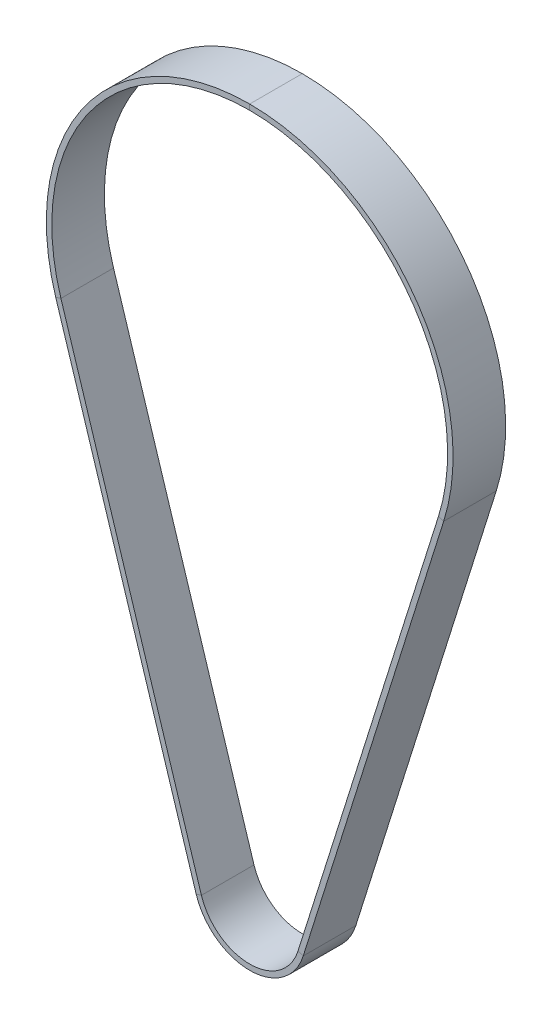
ISO-10303-21;
HEADER;
FILE_DESCRIPTION(('STEP AP214'),'2;1');
FILE_NAME('part.step','',(''),(''),'','','');
FILE_SCHEMA(('AUTOMOTIVE_DESIGN { 1 0 10303 214 1 1 1 1 }'));
ENDSEC;
DATA;
#1=APPLICATION_CONTEXT('core data for automotive mechanical design processes');
#2=APPLICATION_PROTOCOL_DEFINITION('international standard','automotive_design',2000,#1);
#3=PRODUCT_CONTEXT('',#1,'mechanical');
#4=PRODUCT('Part','Part','',(#3));
#5=PRODUCT_RELATED_PRODUCT_CATEGORY('part','',(#4));
#6=PRODUCT_DEFINITION_FORMATION('','',#4);
#7=PRODUCT_DEFINITION_CONTEXT('part definition',#1,'design');
#8=PRODUCT_DEFINITION('design','',#6,#7);
#9=PRODUCT_DEFINITION_SHAPE('','',#8);
#10=(LENGTH_UNIT() NAMED_UNIT(*) SI_UNIT(.MILLI.,.METRE.));
#11=(NAMED_UNIT(*) PLANE_ANGLE_UNIT() SI_UNIT($,.RADIAN.));
#12=(NAMED_UNIT(*) SI_UNIT($,.STERADIAN.) SOLID_ANGLE_UNIT());
#13=UNCERTAINTY_MEASURE_WITH_UNIT(LENGTH_MEASURE(1.E-05),#10,'distance_accuracy_value','');
#14=(GEOMETRIC_REPRESENTATION_CONTEXT(3) GLOBAL_UNCERTAINTY_ASSIGNED_CONTEXT((#13)) GLOBAL_UNIT_ASSIGNED_CONTEXT((#10,
#11,#12)) REPRESENTATION_CONTEXT('',''));
#15=CARTESIAN_POINT('',(0.,0.,0.));
#16=DIRECTION('',(0.,0.,1.));
#17=DIRECTION('',(1.,0.,0.));
#18=AXIS2_PLACEMENT_3D('',#15,#16,#17);
#19=CARTESIAN_POINT('',(0.,0.,0.));
#20=DIRECTION('',(0.,0.,-1.));
#21=DIRECTION('',(-1.,0.,0.));
#22=AXIS2_PLACEMENT_3D('',#19,#20,#21);
#23=CYLINDRICAL_SURFACE('',#22,58.);
#24=CARTESIAN_POINT('',(0.,0.,0.));
#25=DIRECTION('',(0.,0.,-1.));
#26=DIRECTION('',(-0.953939201416946,-0.3,0.));
#27=AXIS2_PLACEMENT_3D('',#24,#25,#26);
#28=CIRCLE('',#27,58.);
#29=CARTESIAN_POINT('',(-55.3284736821829,-17.4,0.));
#30=VERTEX_POINT('',#29);
#31=CARTESIAN_POINT('',(0.,58.,0.));
#32=VERTEX_POINT('',#31);
#33=EDGE_CURVE('E11',#30,#32,#28,.T.);
#34=ORIENTED_EDGE('',*,*,#33,.F.);
#35=DIRECTION('',(0.,0.,1.));
#36=VECTOR('',#35,1.);
#37=CARTESIAN_POINT('',(-55.3284736821828,-17.4,15.));
#38=LINE('',#37,#36);
#39=CARTESIAN_POINT('',(-55.3284736821829,-17.4,15.));
#40=VERTEX_POINT('',#39);
#41=EDGE_CURVE('E42',#30,#40,#38,.T.);
#42=ORIENTED_EDGE('',*,*,#41,.T.);
#43=CARTESIAN_POINT('',(0.,0.,15.));
#44=DIRECTION('',(0.,0.,-1.));
#45=DIRECTION('',(-0.953939201416946,-0.3,0.));
#46=AXIS2_PLACEMENT_3D('',#43,#44,#45);
#47=CIRCLE('',#46,58.);
#48=CARTESIAN_POINT('',(0.,58.,15.));
#49=VERTEX_POINT('',#48);
#50=EDGE_CURVE('E130',#40,#49,#47,.T.);
#51=ORIENTED_EDGE('',*,*,#50,.T.);
#52=DIRECTION('',(0.,0.,1.));
#53=VECTOR('',#52,1.);
#54=CARTESIAN_POINT('',(0.,58.,15.));
#55=LINE('',#54,#53);
#56=EDGE_CURVE('E133',#32,#49,#55,.T.);
#57=ORIENTED_EDGE('',*,*,#56,.F.);
#58=EDGE_LOOP('',(#34,#42,#51,#57));
#59=FACE_BOUND('',#58,.T.);
#60=ADVANCED_FACE('F39',(#59),#23,.T.);
#61=CARTESIAN_POINT('',(-55.3284736821829,-17.4,0.));
#62=DIRECTION('',(0.,0.,-1.));
#63=DIRECTION('',(-1.,0.,0.));
#64=AXIS2_PLACEMENT_3D('',#61,#62,#63);
#65=PLANE('',#64);
#66=CARTESIAN_POINT('',(0.,0.,0.));
#67=DIRECTION('',(0.,0.,-1.));
#68=DIRECTION('',(-0.953939201416946,-0.3,0.));
#69=AXIS2_PLACEMENT_3D('',#66,#67,#68);
#70=CIRCLE('',#69,56.44);
#71=CARTESIAN_POINT('',(-53.8403285279724,-16.932,0.));
#72=VERTEX_POINT('',#71);
#73=CARTESIAN_POINT('',(0.,56.44,0.));
#74=VERTEX_POINT('',#73);
#75=EDGE_CURVE('E47',#72,#74,#70,.T.);
#76=ORIENTED_EDGE('',*,*,#75,.F.);
#77=DIRECTION('',(-0.953939201416946,-0.3,0.));
#78=VECTOR('',#77,1.);
#79=CARTESIAN_POINT('',(-55.3284736821828,-17.4,0.));
#80=LINE('',#79,#78);
#81=EDGE_CURVE('E220',#72,#30,#80,.T.);
#82=ORIENTED_EDGE('',*,*,#81,.T.);
#83=ORIENTED_EDGE('',*,*,#33,.T.);
#84=DIRECTION('',(0.,1.,0.));
#85=VECTOR('',#84,1.);
#86=CARTESIAN_POINT('',(0.,58.,0.));
#87=LINE('',#86,#85);
#88=EDGE_CURVE('E158',#74,#32,#87,.T.);
#89=ORIENTED_EDGE('',*,*,#88,.F.);
#90=EDGE_LOOP('',(#76,#82,#83,#89));
#91=FACE_BOUND('',#90,.T.);
#92=ADVANCED_FACE('F267',(#91),#65,.T.);
#93=CARTESIAN_POINT('',(0.,0.,0.));
#94=DIRECTION('',(0.,0.,-1.));
#95=DIRECTION('',(-1.,0.,0.));
#96=AXIS2_PLACEMENT_3D('',#93,#94,#95);
#97=CYLINDRICAL_SURFACE('',#96,56.44);
#98=CARTESIAN_POINT('',(0.,0.,15.));
#99=DIRECTION('',(0.,0.,-1.));
#100=DIRECTION('',(-0.953939201416946,-0.3,0.));
#101=AXIS2_PLACEMENT_3D('',#98,#99,#100);
#102=CIRCLE('',#101,56.44);
#103=CARTESIAN_POINT('',(-53.8403285279724,-16.932,15.));
#104=VERTEX_POINT('',#103);
#105=CARTESIAN_POINT('',(0.,56.44,15.));
#106=VERTEX_POINT('',#105);
#107=EDGE_CURVE('E139',#104,#106,#102,.T.);
#108=ORIENTED_EDGE('',*,*,#107,.F.);
#109=DIRECTION('',(0.,0.,-1.));
#110=VECTOR('',#109,1.);
#111=CARTESIAN_POINT('',(-53.8403285279724,-16.932,15.));
#112=LINE('',#111,#110);
#113=EDGE_CURVE('E195',#104,#72,#112,.T.);
#114=ORIENTED_EDGE('',*,*,#113,.T.);
#115=ORIENTED_EDGE('',*,*,#75,.T.);
#116=DIRECTION('',(0.,0.,-1.));
#117=VECTOR('',#116,1.);
#118=CARTESIAN_POINT('',(0.,56.44,15.));
#119=LINE('',#118,#117);
#120=EDGE_CURVE('E162',#106,#74,#119,.T.);
#121=ORIENTED_EDGE('',*,*,#120,.F.);
#122=EDGE_LOOP('',(#108,#114,#115,#121));
#123=FACE_BOUND('',#122,.T.);
#124=ADVANCED_FACE('F271',(#123),#97,.F.);
#125=CARTESIAN_POINT('',(-15.2630272226711,-144.8,15.));
#126=DIRECTION('',(-0.953939201416946,-0.3,0.));
#127=DIRECTION('',(0.3,-0.953939201416946,0.));
#128=AXIS2_PLACEMENT_3D('',#125,#126,#127);
#129=PLANE('',#128);
#130=ORIENTED_EDGE('',*,*,#41,.F.);
#131=DIRECTION('',(-0.3,0.953939201416946,0.));
#132=VECTOR('',#131,1.);
#133=CARTESIAN_POINT('',(-15.2630272226711,-144.8,0.));
#134=LINE('',#133,#132);
#135=CARTESIAN_POINT('',(-15.2630272226711,-144.8,0.));
#136=VERTEX_POINT('',#135);
#137=EDGE_CURVE('E234',#136,#30,#134,.T.);
#138=ORIENTED_EDGE('',*,*,#137,.F.);
#139=DIRECTION('',(0.,0.,1.));
#140=VECTOR('',#139,1.);
#141=CARTESIAN_POINT('',(-15.2630272226711,-144.8,15.));
#142=LINE('',#141,#140);
#143=CARTESIAN_POINT('',(-15.2630272226711,-144.8,15.));
#144=VERTEX_POINT('',#143);
#145=EDGE_CURVE('E198',#136,#144,#142,.T.);
#146=ORIENTED_EDGE('',*,*,#145,.T.);
#147=DIRECTION('',(-0.3,0.953939201416946,0.));
#148=VECTOR('',#147,1.);
#149=CARTESIAN_POINT('',(-15.2630272226711,-144.8,15.));
#150=LINE('',#149,#148);
#151=EDGE_CURVE('E192',#144,#40,#150,.T.);
#152=ORIENTED_EDGE('',*,*,#151,.T.);
#153=EDGE_LOOP('',(#130,#138,#146,#152));
#154=FACE_BOUND('',#153,.T.);
#155=ADVANCED_FACE('F243',(#154),#129,.T.);
#156=CARTESIAN_POINT('',(-15.2630272226711,-144.8,0.));
#157=DIRECTION('',(0.,0.,-1.));
#158=DIRECTION('',(-1.,0.,0.));
#159=AXIS2_PLACEMENT_3D('',#156,#157,#158);
#160=PLANE('',#159);
#161=ORIENTED_EDGE('',*,*,#137,.T.);
#162=ORIENTED_EDGE('',*,*,#81,.F.);
#163=DIRECTION('',(-0.3,0.953939201416946,0.));
#164=VECTOR('',#163,1.);
#165=CARTESIAN_POINT('',(-13.7748820684607,-144.332,0.));
#166=LINE('',#165,#164);
#167=CARTESIAN_POINT('',(-13.7748820684607,-144.332,0.));
#168=VERTEX_POINT('',#167);
#169=EDGE_CURVE('E217',#168,#72,#166,.T.);
#170=ORIENTED_EDGE('',*,*,#169,.F.);
#171=DIRECTION('',(-0.953939201416945,-0.300000000000001,0.));
#172=VECTOR('',#171,1.);
#173=CARTESIAN_POINT('',(-15.2630272226711,-144.8,0.));
#174=LINE('',#173,#172);
#175=EDGE_CURVE('E213',#168,#136,#174,.T.);
#176=ORIENTED_EDGE('',*,*,#175,.T.);
#177=EDGE_LOOP('',(#161,#162,#170,#176));
#178=FACE_BOUND('',#177,.T.);
#179=ADVANCED_FACE('F280',(#178),#160,.T.);
#180=CARTESIAN_POINT('',(-13.7748820684607,-144.332,15.));
#181=DIRECTION('',(0.953939201416946,0.3,0.));
#182=DIRECTION('',(-0.3,0.953939201416946,0.));
#183=AXIS2_PLACEMENT_3D('',#180,#181,#182);
#184=PLANE('',#183);
#185=ORIENTED_EDGE('',*,*,#169,.T.);
#186=ORIENTED_EDGE('',*,*,#113,.F.);
#187=DIRECTION('',(-0.3,0.953939201416946,0.));
#188=VECTOR('',#187,1.);
#189=CARTESIAN_POINT('',(-13.7748820684607,-144.332,15.));
#190=LINE('',#189,#188);
#191=CARTESIAN_POINT('',(-13.7748820684607,-144.332,15.));
#192=VERTEX_POINT('',#191);
#193=EDGE_CURVE('E191',#192,#104,#190,.T.);
#194=ORIENTED_EDGE('',*,*,#193,.F.);
#195=DIRECTION('',(0.,0.,-1.));
#196=VECTOR('',#195,1.);
#197=CARTESIAN_POINT('',(-13.7748820684607,-144.332,15.));
#198=LINE('',#197,#196);
#199=EDGE_CURVE('E184',#192,#168,#198,.T.);
#200=ORIENTED_EDGE('',*,*,#199,.T.);
#201=EDGE_LOOP('',(#185,#186,#194,#200));
#202=FACE_BOUND('',#201,.T.);
#203=ADVANCED_FACE('F251',(#202),#184,.T.);
#204=CARTESIAN_POINT('',(-15.2630272226711,-144.8,15.));
#205=DIRECTION('',(0.,0.,1.));
#206=DIRECTION('',(1.,0.,0.));
#207=AXIS2_PLACEMENT_3D('',#204,#205,#206);
#208=PLANE('',#207);
#209=ORIENTED_EDGE('',*,*,#193,.T.);
#210=DIRECTION('',(0.953939201416946,0.3,0.));
#211=VECTOR('',#210,1.);
#212=CARTESIAN_POINT('',(-55.3284736821828,-17.4,15.));
#213=LINE('',#212,#211);
#214=EDGE_CURVE('E189',#40,#104,#213,.T.);
#215=ORIENTED_EDGE('',*,*,#214,.F.);
#216=ORIENTED_EDGE('',*,*,#151,.F.);
#217=DIRECTION('',(0.953939201416945,0.300000000000001,0.));
#218=VECTOR('',#217,1.);
#219=CARTESIAN_POINT('',(-15.2630272226711,-144.8,15.));
#220=LINE('',#219,#218);
#221=EDGE_CURVE('E181',#144,#192,#220,.T.);
#222=ORIENTED_EDGE('',*,*,#221,.T.);
#223=EDGE_LOOP('',(#209,#215,#216,#222));
#224=FACE_BOUND('',#223,.T.);
#225=ADVANCED_FACE('F248',(#224),#208,.T.);
#226=CARTESIAN_POINT('',(0.,-140.,0.));
#227=DIRECTION('',(0.,0.,-1.));
#228=DIRECTION('',(-1.,0.,0.));
#229=AXIS2_PLACEMENT_3D('',#226,#227,#228);
#230=CYLINDRICAL_SURFACE('',#229,16.);
#231=ORIENTED_EDGE('',*,*,#145,.F.);
#232=CARTESIAN_POINT('',(0.,-140.,0.));
#233=DIRECTION('',(0.,0.,-1.));
#234=DIRECTION('',(0.953939201416946,-0.3,0.));
#235=AXIS2_PLACEMENT_3D('',#232,#233,#234);
#236=CIRCLE('',#235,16.);
#237=CARTESIAN_POINT('',(15.2630272226711,-144.8,0.));
#238=VERTEX_POINT('',#237);
#239=EDGE_CURVE('E88',#238,#136,#236,.T.);
#240=ORIENTED_EDGE('',*,*,#239,.F.);
#241=DIRECTION('',(0.,0.,1.));
#242=VECTOR('',#241,1.);
#243=CARTESIAN_POINT('',(15.2630272226711,-144.8,15.));
#244=LINE('',#243,#242);
#245=CARTESIAN_POINT('',(15.2630272226711,-144.8,15.));
#246=VERTEX_POINT('',#245);
#247=EDGE_CURVE('E188',#238,#246,#244,.T.);
#248=ORIENTED_EDGE('',*,*,#247,.T.);
#249=CARTESIAN_POINT('',(0.,-140.,15.));
#250=DIRECTION('',(0.,0.,-1.));
#251=DIRECTION('',(0.953939201416946,-0.3,0.));
#252=AXIS2_PLACEMENT_3D('',#249,#250,#251);
#253=CIRCLE('',#252,16.);
#254=EDGE_CURVE('E186',#246,#144,#253,.T.);
#255=ORIENTED_EDGE('',*,*,#254,.T.);
#256=EDGE_LOOP('',(#231,#240,#248,#255));
#257=FACE_BOUND('',#256,.T.);
#258=ADVANCED_FACE('F262',(#257),#230,.T.);
#259=CARTESIAN_POINT('',(15.2630272226711,-144.8,0.));
#260=DIRECTION('',(0.,0.,-1.));
#261=DIRECTION('',(-1.,0.,0.));
#262=AXIS2_PLACEMENT_3D('',#259,#260,#261);
#263=PLANE('',#262);
#264=ORIENTED_EDGE('',*,*,#239,.T.);
#265=ORIENTED_EDGE('',*,*,#175,.F.);
#266=CARTESIAN_POINT('',(0.,-140.,0.));
#267=DIRECTION('',(0.,0.,-1.));
#268=DIRECTION('',(0.953939201416946,-0.3,0.));
#269=AXIS2_PLACEMENT_3D('',#266,#267,#268);
#270=CIRCLE('',#269,14.44);
#271=CARTESIAN_POINT('',(13.7748820684607,-144.332,0.));
#272=VERTEX_POINT('',#271);
#273=EDGE_CURVE('E98',#272,#168,#270,.T.);
#274=ORIENTED_EDGE('',*,*,#273,.F.);
#275=DIRECTION('',(0.953939201416946,-0.3,0.));
#276=VECTOR('',#275,1.);
#277=CARTESIAN_POINT('',(15.2630272226711,-144.8,0.));
#278=LINE('',#277,#276);
#279=EDGE_CURVE('E210',#272,#238,#278,.T.);
#280=ORIENTED_EDGE('',*,*,#279,.T.);
#281=EDGE_LOOP('',(#264,#265,#274,#280));
#282=FACE_BOUND('',#281,.T.);
#283=ADVANCED_FACE('F254',(#282),#263,.T.);
#284=CARTESIAN_POINT('',(0.,-140.,0.));
#285=DIRECTION('',(0.,0.,-1.));
#286=DIRECTION('',(-1.,0.,0.));
#287=AXIS2_PLACEMENT_3D('',#284,#285,#286);
#288=CYLINDRICAL_SURFACE('',#287,14.44);
#289=ORIENTED_EDGE('',*,*,#273,.T.);
#290=ORIENTED_EDGE('',*,*,#199,.F.);
#291=CARTESIAN_POINT('',(0.,-140.,15.));
#292=DIRECTION('',(0.,0.,-1.));
#293=DIRECTION('',(0.953939201416946,-0.3,0.));
#294=AXIS2_PLACEMENT_3D('',#291,#292,#293);
#295=CIRCLE('',#294,14.44);
#296=CARTESIAN_POINT('',(13.7748820684607,-144.332,15.));
#297=VERTEX_POINT('',#296);
#298=EDGE_CURVE('E106',#297,#192,#295,.T.);
#299=ORIENTED_EDGE('',*,*,#298,.F.);
#300=DIRECTION('',(0.,0.,-1.));
#301=VECTOR('',#300,1.);
#302=CARTESIAN_POINT('',(13.7748820684607,-144.332,15.));
#303=LINE('',#302,#301);
#304=EDGE_CURVE('E177',#297,#272,#303,.T.);
#305=ORIENTED_EDGE('',*,*,#304,.T.);
#306=EDGE_LOOP('',(#289,#290,#299,#305));
#307=FACE_BOUND('',#306,.T.);
#308=ADVANCED_FACE('F252',(#307),#288,.F.);
#309=CARTESIAN_POINT('',(15.2630272226711,-144.8,15.));
#310=DIRECTION('',(0.,0.,1.));
#311=DIRECTION('',(1.,0.,0.));
#312=AXIS2_PLACEMENT_3D('',#309,#310,#311);
#313=PLANE('',#312);
#314=ORIENTED_EDGE('',*,*,#298,.T.);
#315=ORIENTED_EDGE('',*,*,#221,.F.);
#316=ORIENTED_EDGE('',*,*,#254,.F.);
#317=DIRECTION('',(-0.953939201416946,0.3,0.));
#318=VECTOR('',#317,1.);
#319=CARTESIAN_POINT('',(15.2630272226711,-144.8,15.));
#320=LINE('',#319,#318);
#321=EDGE_CURVE('E171',#246,#297,#320,.T.);
#322=ORIENTED_EDGE('',*,*,#321,.T.);
#323=EDGE_LOOP('',(#314,#315,#316,#322));
#324=FACE_BOUND('',#323,.T.);
#325=ADVANCED_FACE('F246',(#324),#313,.T.);
#326=CARTESIAN_POINT('',(55.3284736821828,-17.4,15.));
#327=DIRECTION('',(0.953939201416946,-0.3,0.));
#328=DIRECTION('',(0.3,0.953939201416946,0.));
#329=AXIS2_PLACEMENT_3D('',#326,#327,#328);
#330=PLANE('',#329);
#331=ORIENTED_EDGE('',*,*,#247,.F.);
#332=DIRECTION('',(-0.3,-0.953939201416946,0.));
#333=VECTOR('',#332,1.);
#334=CARTESIAN_POINT('',(55.3284736821828,-17.4,0.));
#335=LINE('',#334,#333);
#336=CARTESIAN_POINT('',(55.3284736821829,-17.4,0.));
#337=VERTEX_POINT('',#336);
#338=EDGE_CURVE('E227',#337,#238,#335,.T.);
#339=ORIENTED_EDGE('',*,*,#338,.F.);
#340=DIRECTION('',(0.,0.,1.));
#341=VECTOR('',#340,1.);
#342=CARTESIAN_POINT('',(55.3284736821829,-17.4,15.));
#343=LINE('',#342,#341);
#344=CARTESIAN_POINT('',(55.3284736821829,-17.4,15.));
#345=VERTEX_POINT('',#344);
#346=EDGE_CURVE('E180',#337,#345,#343,.T.);
#347=ORIENTED_EDGE('',*,*,#346,.T.);
#348=DIRECTION('',(-0.3,-0.953939201416946,0.));
#349=VECTOR('',#348,1.);
#350=CARTESIAN_POINT('',(55.3284736821828,-17.4,15.));
#351=LINE('',#350,#349);
#352=EDGE_CURVE('E174',#345,#246,#351,.T.);
#353=ORIENTED_EDGE('',*,*,#352,.T.);
#354=EDGE_LOOP('',(#331,#339,#347,#353));
#355=FACE_BOUND('',#354,.T.);
#356=ADVANCED_FACE('F260',(#355),#330,.T.);
#357=CARTESIAN_POINT('',(55.3284736821828,-17.4,0.));
#358=DIRECTION('',(0.,0.,-1.));
#359=DIRECTION('',(-1.,0.,0.));
#360=AXIS2_PLACEMENT_3D('',#357,#358,#359);
#361=PLANE('',#360);
#362=ORIENTED_EDGE('',*,*,#338,.T.);
#363=ORIENTED_EDGE('',*,*,#279,.F.);
#364=DIRECTION('',(-0.3,-0.953939201416946,0.));
#365=VECTOR('',#364,1.);
#366=CARTESIAN_POINT('',(53.8403285279724,-16.932,0.));
#367=LINE('',#366,#365);
#368=CARTESIAN_POINT('',(53.8403285279724,-16.932,0.));
#369=VERTEX_POINT('',#368);
#370=EDGE_CURVE('E207',#369,#272,#367,.T.);
#371=ORIENTED_EDGE('',*,*,#370,.F.);
#372=DIRECTION('',(0.953939201416946,-0.299999999999999,0.));
#373=VECTOR('',#372,1.);
#374=CARTESIAN_POINT('',(55.3284736821829,-17.4,0.));
#375=LINE('',#374,#373);
#376=EDGE_CURVE('E205',#369,#337,#375,.T.);
#377=ORIENTED_EDGE('',*,*,#376,.T.);
#378=EDGE_LOOP('',(#362,#363,#371,#377));
#379=FACE_BOUND('',#378,.T.);
#380=ADVANCED_FACE('F287',(#379),#361,.T.);
#381=CARTESIAN_POINT('',(53.8403285279724,-16.932,15.));
#382=DIRECTION('',(-0.953939201416946,0.3,0.));
#383=DIRECTION('',(-0.3,-0.953939201416946,0.));
#384=AXIS2_PLACEMENT_3D('',#381,#382,#383);
#385=PLANE('',#384);
#386=ORIENTED_EDGE('',*,*,#370,.T.);
#387=ORIENTED_EDGE('',*,*,#304,.F.);
#388=DIRECTION('',(-0.3,-0.953939201416946,0.));
#389=VECTOR('',#388,1.);
#390=CARTESIAN_POINT('',(53.8403285279724,-16.932,15.));
#391=LINE('',#390,#389);
#392=CARTESIAN_POINT('',(53.8403285279724,-16.932,15.));
#393=VERTEX_POINT('',#392);
#394=EDGE_CURVE('E173',#393,#297,#391,.T.);
#395=ORIENTED_EDGE('',*,*,#394,.F.);
#396=DIRECTION('',(0.,0.,-1.));
#397=VECTOR('',#396,1.);
#398=CARTESIAN_POINT('',(53.8403285279724,-16.932,15.));
#399=LINE('',#398,#397);
#400=EDGE_CURVE('E169',#393,#369,#399,.T.);
#401=ORIENTED_EDGE('',*,*,#400,.T.);
#402=EDGE_LOOP('',(#386,#387,#395,#401));
#403=FACE_BOUND('',#402,.T.);
#404=ADVANCED_FACE('F307',(#403),#385,.T.);
#405=CARTESIAN_POINT('',(55.3284736821828,-17.4,15.));
#406=DIRECTION('',(0.,0.,1.));
#407=DIRECTION('',(1.,0.,0.));
#408=AXIS2_PLACEMENT_3D('',#405,#406,#407);
#409=PLANE('',#408);
#410=ORIENTED_EDGE('',*,*,#394,.T.);
#411=ORIENTED_EDGE('',*,*,#321,.F.);
#412=ORIENTED_EDGE('',*,*,#352,.F.);
#413=DIRECTION('',(-0.953939201416946,0.299999999999999,0.));
#414=VECTOR('',#413,1.);
#415=CARTESIAN_POINT('',(55.3284736821829,-17.4,15.));
#416=LINE('',#415,#414);
#417=EDGE_CURVE('E150',#345,#393,#416,.T.);
#418=ORIENTED_EDGE('',*,*,#417,.T.);
#419=EDGE_LOOP('',(#410,#411,#412,#418));
#420=FACE_BOUND('',#419,.T.);
#421=ADVANCED_FACE('F284',(#420),#409,.T.);
#422=CARTESIAN_POINT('',(0.,0.,0.));
#423=DIRECTION('',(0.,0.,-1.));
#424=DIRECTION('',(-1.,0.,0.));
#425=AXIS2_PLACEMENT_3D('',#422,#423,#424);
#426=CYLINDRICAL_SURFACE('',#425,58.);
#427=ORIENTED_EDGE('',*,*,#346,.F.);
#428=CARTESIAN_POINT('',(0.,0.,0.));
#429=DIRECTION('',(0.,0.,-1.));
#430=DIRECTION('',(0.,1.,0.));
#431=AXIS2_PLACEMENT_3D('',#428,#429,#430);
#432=CIRCLE('',#431,58.);
#433=EDGE_CURVE('E157',#32,#337,#432,.T.);
#434=ORIENTED_EDGE('',*,*,#433,.F.);
#435=ORIENTED_EDGE('',*,*,#56,.T.);
#436=CARTESIAN_POINT('',(0.,0.,15.));
#437=DIRECTION('',(0.,0.,-1.));
#438=DIRECTION('',(0.,1.,0.));
#439=AXIS2_PLACEMENT_3D('',#436,#437,#438);
#440=CIRCLE('',#439,58.);
#441=EDGE_CURVE('E145',#49,#345,#440,.T.);
#442=ORIENTED_EDGE('',*,*,#441,.T.);
#443=EDGE_LOOP('',(#427,#434,#435,#442));
#444=FACE_BOUND('',#443,.T.);
#445=ADVANCED_FACE('F155',(#444),#426,.T.);
#446=CARTESIAN_POINT('',(0.,58.,0.));
#447=DIRECTION('',(0.,0.,-1.));
#448=DIRECTION('',(-1.,0.,0.));
#449=AXIS2_PLACEMENT_3D('',#446,#447,#448);
#450=PLANE('',#449);
#451=ORIENTED_EDGE('',*,*,#433,.T.);
#452=ORIENTED_EDGE('',*,*,#376,.F.);
#453=CARTESIAN_POINT('',(0.,0.,0.));
#454=DIRECTION('',(0.,0.,-1.));
#455=DIRECTION('',(0.,1.,0.));
#456=AXIS2_PLACEMENT_3D('',#453,#454,#455);
#457=CIRCLE('',#456,56.44);
#458=EDGE_CURVE('E202',#74,#369,#457,.T.);
#459=ORIENTED_EDGE('',*,*,#458,.F.);
#460=ORIENTED_EDGE('',*,*,#88,.T.);
#461=EDGE_LOOP('',(#451,#452,#459,#460));
#462=FACE_BOUND('',#461,.T.);
#463=ADVANCED_FACE('F283',(#462),#450,.T.);
#464=CARTESIAN_POINT('',(0.,0.,0.));
#465=DIRECTION('',(0.,0.,-1.));
#466=DIRECTION('',(-1.,0.,0.));
#467=AXIS2_PLACEMENT_3D('',#464,#465,#466);
#468=CYLINDRICAL_SURFACE('',#467,56.44);
#469=ORIENTED_EDGE('',*,*,#458,.T.);
#470=ORIENTED_EDGE('',*,*,#400,.F.);
#471=CARTESIAN_POINT('',(0.,0.,15.));
#472=DIRECTION('',(0.,0.,-1.));
#473=DIRECTION('',(0.,1.,0.));
#474=AXIS2_PLACEMENT_3D('',#471,#472,#473);
#475=CIRCLE('',#474,56.44);
#476=EDGE_CURVE('E168',#106,#393,#475,.T.);
#477=ORIENTED_EDGE('',*,*,#476,.F.);
#478=ORIENTED_EDGE('',*,*,#120,.T.);
#479=EDGE_LOOP('',(#469,#470,#477,#478));
#480=FACE_BOUND('',#479,.T.);
#481=ADVANCED_FACE('F302',(#480),#468,.F.);
#482=CARTESIAN_POINT('',(0.,58.,15.));
#483=DIRECTION('',(0.,0.,1.));
#484=DIRECTION('',(1.,0.,0.));
#485=AXIS2_PLACEMENT_3D('',#482,#483,#484);
#486=PLANE('',#485);
#487=ORIENTED_EDGE('',*,*,#476,.T.);
#488=ORIENTED_EDGE('',*,*,#417,.F.);
#489=ORIENTED_EDGE('',*,*,#441,.F.);
#490=DIRECTION('',(0.,-1.,0.));
#491=VECTOR('',#490,1.);
#492=CARTESIAN_POINT('',(0.,58.,15.));
#493=LINE('',#492,#491);
#494=EDGE_CURVE('E148',#49,#106,#493,.T.);
#495=ORIENTED_EDGE('',*,*,#494,.T.);
#496=EDGE_LOOP('',(#487,#488,#489,#495));
#497=FACE_BOUND('',#496,.T.);
#498=ADVANCED_FACE('F147',(#497),#486,.T.);
#499=CARTESIAN_POINT('',(-55.3284736821829,-17.4,15.));
#500=DIRECTION('',(0.,0.,1.));
#501=DIRECTION('',(1.,0.,0.));
#502=AXIS2_PLACEMENT_3D('',#499,#500,#501);
#503=PLANE('',#502);
#504=ORIENTED_EDGE('',*,*,#214,.T.);
#505=ORIENTED_EDGE('',*,*,#107,.T.);
#506=ORIENTED_EDGE('',*,*,#494,.F.);
#507=ORIENTED_EDGE('',*,*,#50,.F.);
#508=EDGE_LOOP('',(#504,#505,#506,#507));
#509=FACE_BOUND('',#508,.T.);
#510=ADVANCED_FACE('F160',(#509),#503,.T.);
#511=CLOSED_SHELL('',(#60,#92,#124,#155,#179,#203,#225,#258,#283,#308,#325,#356,#380,#404,#421,
#445,#463,#481,#498,#510));
#512=MANIFOLD_SOLID_BREP('B2',#511);
#513=ADVANCED_BREP_SHAPE_REPRESENTATION('',(#18,#512),#14);
#514=SHAPE_DEFINITION_REPRESENTATION(#9,#513);
ENDSEC;
END-ISO-10303-21;
